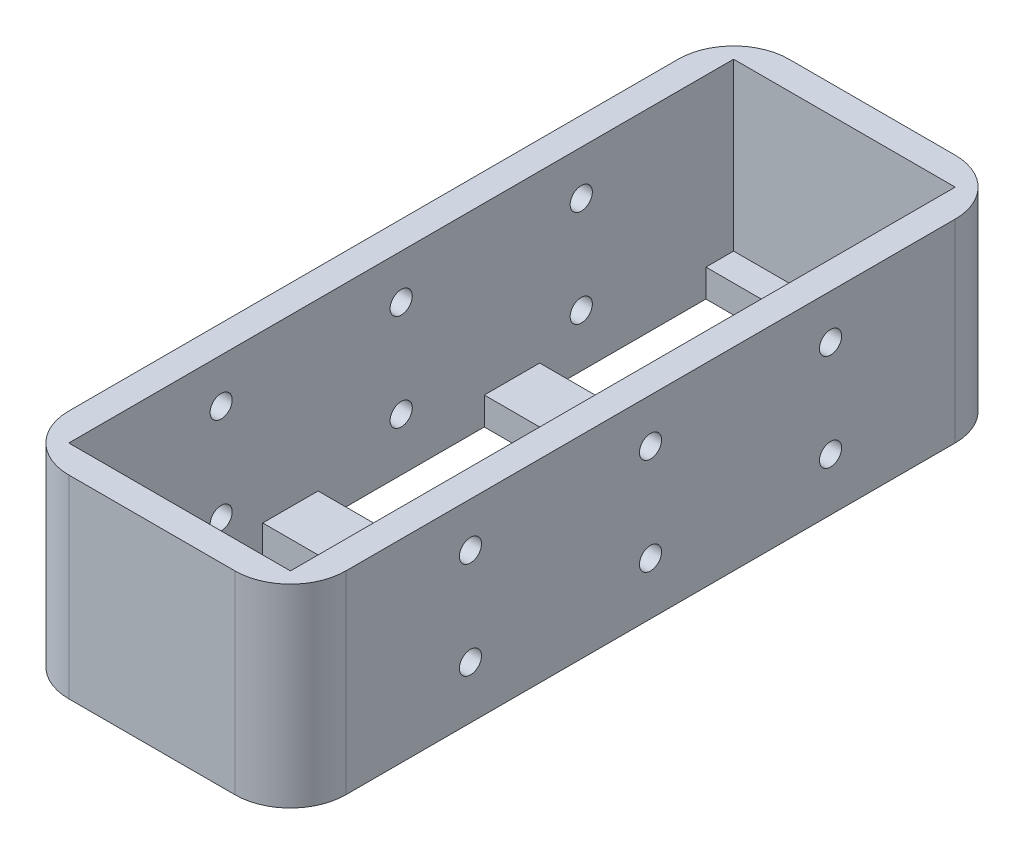
ISO-10303-21;
HEADER;
FILE_DESCRIPTION(('STEP AP214'),'2;1');
FILE_NAME('part.step','',(''),(''),'','','');
FILE_SCHEMA(('AUTOMOTIVE_DESIGN { 1 0 10303 214 1 1 1 1 }'));
ENDSEC;
DATA;
#1=APPLICATION_CONTEXT('core data for automotive mechanical design processes');
#2=APPLICATION_PROTOCOL_DEFINITION('international standard','automotive_design',2000,#1);
#3=PRODUCT_CONTEXT('',#1,'mechanical');
#4=PRODUCT('Part','Part','',(#3));
#5=PRODUCT_RELATED_PRODUCT_CATEGORY('part','',(#4));
#6=PRODUCT_DEFINITION_FORMATION('','',#4);
#7=PRODUCT_DEFINITION_CONTEXT('part definition',#1,'design');
#8=PRODUCT_DEFINITION('design','',#6,#7);
#9=PRODUCT_DEFINITION_SHAPE('','',#8);
#10=(LENGTH_UNIT() NAMED_UNIT(*) SI_UNIT(.MILLI.,.METRE.));
#11=(NAMED_UNIT(*) PLANE_ANGLE_UNIT() SI_UNIT($,.RADIAN.));
#12=(NAMED_UNIT(*) SI_UNIT($,.STERADIAN.) SOLID_ANGLE_UNIT());
#13=UNCERTAINTY_MEASURE_WITH_UNIT(LENGTH_MEASURE(1.E-05),#10,'distance_accuracy_value','');
#14=(GEOMETRIC_REPRESENTATION_CONTEXT(3) GLOBAL_UNCERTAINTY_ASSIGNED_CONTEXT((#13)) GLOBAL_UNIT_ASSIGNED_CONTEXT((#10,
#11,#12)) REPRESENTATION_CONTEXT('',''));
#15=CARTESIAN_POINT('',(0.,0.,0.));
#16=DIRECTION('',(0.,0.,1.));
#17=DIRECTION('',(1.,0.,0.));
#18=AXIS2_PLACEMENT_3D('',#15,#16,#17);
#19=CARTESIAN_POINT('',(-137.729964847329,6.35,0.));
#20=DIRECTION('',(0.,1.,0.));
#21=DIRECTION('',(0.,0.,1.));
#22=AXIS2_PLACEMENT_3D('',#19,#20,#21);
#23=PLANE('',#22);
#24=DIRECTION('',(-1.,0.,0.));
#25=VECTOR('',#24,1.);
#26=CARTESIAN_POINT('',(-137.729964847329,6.35,-31.75));
#27=LINE('',#26,#25);
#28=CARTESIAN_POINT('',(25.4,6.35,-31.75));
#29=VERTEX_POINT('',#28);
#30=CARTESIAN_POINT('',(-25.4,6.35,-31.75));
#31=VERTEX_POINT('',#30);
#32=EDGE_CURVE('E428',#29,#31,#27,.T.);
#33=ORIENTED_EDGE('',*,*,#32,.T.);
#34=DIRECTION('',(0.,0.,1.));
#35=VECTOR('',#34,1.);
#36=CARTESIAN_POINT('',(-25.4,6.35,0.));
#37=LINE('',#36,#35);
#38=CARTESIAN_POINT('',(-25.4,6.35,-19.05));
#39=VERTEX_POINT('',#38);
#40=EDGE_CURVE('E262',#31,#39,#37,.T.);
#41=ORIENTED_EDGE('',*,*,#40,.T.);
#42=DIRECTION('',(1.,0.,0.));
#43=VECTOR('',#42,1.);
#44=CARTESIAN_POINT('',(-137.729964847329,6.35,-19.05));
#45=LINE('',#44,#43);
#46=CARTESIAN_POINT('',(25.4,6.35,-19.05));
#47=VERTEX_POINT('',#46);
#48=EDGE_CURVE('E445',#39,#47,#45,.T.);
#49=ORIENTED_EDGE('',*,*,#48,.T.);
#50=DIRECTION('',(0.,0.,1.));
#51=VECTOR('',#50,1.);
#52=CARTESIAN_POINT('',(25.4,6.35,0.));
#53=LINE('',#52,#51);
#54=EDGE_CURVE('E283',#29,#47,#53,.T.);
#55=ORIENTED_EDGE('',*,*,#54,.F.);
#56=EDGE_LOOP('',(#33,#41,#49,#55));
#57=FACE_BOUND('',#56,.T.);
#58=ADVANCED_FACE('F33',(#57),#23,.T.);
#59=DIRECTION('',(1.,0.,0.));
#60=VECTOR('',#59,1.);
#61=CARTESIAN_POINT('',(-137.729964847329,6.35,19.05));
#62=LINE('',#61,#60);
#63=CARTESIAN_POINT('',(-25.4,6.35,19.05));
#64=VERTEX_POINT('',#63);
#65=CARTESIAN_POINT('',(25.4,6.35,19.05));
#66=VERTEX_POINT('',#65);
#67=EDGE_CURVE('E449',#64,#66,#62,.T.);
#68=ORIENTED_EDGE('',*,*,#67,.F.);
#69=CARTESIAN_POINT('',(-25.4,6.35,31.75));
#70=VERTEX_POINT('',#69);
#71=EDGE_CURVE('E281',#64,#70,#37,.T.);
#72=ORIENTED_EDGE('',*,*,#71,.T.);
#73=DIRECTION('',(1.,0.,0.));
#74=VECTOR('',#73,1.);
#75=CARTESIAN_POINT('',(-137.729964847329,6.35,31.75));
#76=LINE('',#75,#74);
#77=CARTESIAN_POINT('',(25.4,6.35,31.75));
#78=VERTEX_POINT('',#77);
#79=EDGE_CURVE('E460',#70,#78,#76,.T.);
#80=ORIENTED_EDGE('',*,*,#79,.T.);
#81=EDGE_CURVE('E272',#66,#78,#53,.T.);
#82=ORIENTED_EDGE('',*,*,#81,.F.);
#83=EDGE_LOOP('',(#68,#72,#80,#82));
#84=FACE_BOUND('',#83,.T.);
#85=ADVANCED_FACE('F522',(#84),#23,.T.);
#86=DIRECTION('',(1.,0.,0.));
#87=VECTOR('',#86,1.);
#88=CARTESIAN_POINT('',(-137.729964847329,6.35,69.85));
#89=LINE('',#88,#87);
#90=CARTESIAN_POINT('',(-25.4,6.35,69.85));
#91=VERTEX_POINT('',#90);
#92=CARTESIAN_POINT('',(25.4,6.35,69.85));
#93=VERTEX_POINT('',#92);
#94=EDGE_CURVE('E438',#91,#93,#89,.T.);
#95=ORIENTED_EDGE('',*,*,#94,.F.);
#96=CARTESIAN_POINT('',(-25.4,6.35,76.2));
#97=VERTEX_POINT('',#96);
#98=EDGE_CURVE('E268',#91,#97,#37,.T.);
#99=ORIENTED_EDGE('',*,*,#98,.T.);
#100=DIRECTION('',(-1.,0.,0.));
#101=VECTOR('',#100,1.);
#102=CARTESIAN_POINT('',(-137.729964847329,6.35,76.2));
#103=LINE('',#102,#101);
#104=CARTESIAN_POINT('',(25.4,6.35,76.2));
#105=VERTEX_POINT('',#104);
#106=EDGE_CURVE('E217',#105,#97,#103,.T.);
#107=ORIENTED_EDGE('',*,*,#106,.F.);
#108=EDGE_CURVE('E273',#93,#105,#53,.T.);
#109=ORIENTED_EDGE('',*,*,#108,.F.);
#110=EDGE_LOOP('',(#95,#99,#107,#109));
#111=FACE_BOUND('',#110,.T.);
#112=ADVANCED_FACE('F480',(#111),#23,.T.);
#113=DIRECTION('',(-1.,0.,0.));
#114=VECTOR('',#113,1.);
#115=CARTESIAN_POINT('',(-137.729964847329,6.35,-76.2));
#116=LINE('',#115,#114);
#117=CARTESIAN_POINT('',(25.4,6.35,-76.2));
#118=VERTEX_POINT('',#117);
#119=CARTESIAN_POINT('',(-25.4,6.35,-76.2));
#120=VERTEX_POINT('',#119);
#121=EDGE_CURVE('E238',#118,#120,#116,.T.);
#122=ORIENTED_EDGE('',*,*,#121,.T.);
#123=CARTESIAN_POINT('',(-25.4,6.35,-69.85));
#124=VERTEX_POINT('',#123);
#125=EDGE_CURVE('E202',#120,#124,#37,.T.);
#126=ORIENTED_EDGE('',*,*,#125,.T.);
#127=DIRECTION('',(1.,0.,0.));
#128=VECTOR('',#127,1.);
#129=CARTESIAN_POINT('',(-137.729964847329,6.35,-69.85));
#130=LINE('',#129,#128);
#131=CARTESIAN_POINT('',(25.4,6.35,-69.85));
#132=VERTEX_POINT('',#131);
#133=EDGE_CURVE('E432',#124,#132,#130,.T.);
#134=ORIENTED_EDGE('',*,*,#133,.T.);
#135=EDGE_CURVE('E240',#118,#132,#53,.T.);
#136=ORIENTED_EDGE('',*,*,#135,.F.);
#137=EDGE_LOOP('',(#122,#126,#134,#136));
#138=FACE_BOUND('',#137,.T.);
#139=ADVANCED_FACE('F494',(#138),#23,.T.);
#140=CARTESIAN_POINT('',(-137.729964847329,6.35,19.05));
#141=DIRECTION('',(0.,0.,-1.));
#142=DIRECTION('',(-1.,0.,0.));
#143=AXIS2_PLACEMENT_3D('',#140,#141,#142);
#144=PLANE('',#143);
#145=DIRECTION('',(1.,0.,0.));
#146=VECTOR('',#145,1.);
#147=CARTESIAN_POINT('',(-137.729964847329,0.,19.05));
#148=LINE('',#147,#146);
#149=CARTESIAN_POINT('',(-25.4,0.,19.05));
#150=VERTEX_POINT('',#149);
#151=CARTESIAN_POINT('',(25.4,0.,19.05));
#152=VERTEX_POINT('',#151);
#153=EDGE_CURVE('E421',#150,#152,#148,.T.);
#154=ORIENTED_EDGE('',*,*,#153,.F.);
#155=DIRECTION('',(0.,-1.,0.));
#156=VECTOR('',#155,1.);
#157=CARTESIAN_POINT('',(-25.4,6.35,19.05));
#158=LINE('',#157,#156);
#159=EDGE_CURVE('E289',#64,#150,#158,.T.);
#160=ORIENTED_EDGE('',*,*,#159,.F.);
#161=ORIENTED_EDGE('',*,*,#67,.T.);
#162=DIRECTION('',(0.,-1.,0.));
#163=VECTOR('',#162,1.);
#164=CARTESIAN_POINT('',(25.4,6.35,19.05));
#165=LINE('',#164,#163);
#166=EDGE_CURVE('E278',#66,#152,#165,.T.);
#167=ORIENTED_EDGE('',*,*,#166,.T.);
#168=EDGE_LOOP('',(#154,#160,#161,#167));
#169=FACE_BOUND('',#168,.T.);
#170=ADVANCED_FACE('F517',(#169),#144,.T.);
#171=CARTESIAN_POINT('',(-25.4,6.35,0.));
#172=DIRECTION('',(-1.,0.,0.));
#173=DIRECTION('',(0.,0.,1.));
#174=AXIS2_PLACEMENT_3D('',#171,#172,#173);
#175=PLANE('',#174);
#176=CARTESIAN_POINT('',(-25.4,12.065,0.));
#177=DIRECTION('',(-1.,0.,0.));
#178=DIRECTION('',(0.,0.,1.));
#179=AXIS2_PLACEMENT_3D('',#176,#177,#178);
#180=CIRCLE('',#179,2.54);
#181=CARTESIAN_POINT('',(-25.4,12.065,2.54));
#182=VERTEX_POINT('',#181);
#183=EDGE_CURVE('E344',#182,#182,#180,.T.);
#184=ORIENTED_EDGE('',*,*,#183,.T.);
#185=EDGE_LOOP('',(#184));
#186=FACE_BOUND('',#185,.T.);
#187=CARTESIAN_POINT('',(-25.4,12.065,-41.275));
#188=DIRECTION('',(-1.,0.,0.));
#189=DIRECTION('',(0.,0.,1.));
#190=AXIS2_PLACEMENT_3D('',#187,#188,#189);
#191=CIRCLE('',#190,2.54);
#192=CARTESIAN_POINT('',(-25.4,12.065,-38.735));
#193=VERTEX_POINT('',#192);
#194=EDGE_CURVE('E339',#193,#193,#191,.T.);
#195=ORIENTED_EDGE('',*,*,#194,.T.);
#196=EDGE_LOOP('',(#195));
#197=FACE_BOUND('',#196,.T.);
#198=CARTESIAN_POINT('',(-25.4,12.065,41.275));
#199=DIRECTION('',(-1.,0.,0.));
#200=DIRECTION('',(0.,0.,1.));
#201=AXIS2_PLACEMENT_3D('',#198,#199,#200);
#202=CIRCLE('',#201,2.54);
#203=CARTESIAN_POINT('',(-25.4,12.065,43.815));
#204=VERTEX_POINT('',#203);
#205=EDGE_CURVE('E334',#204,#204,#202,.T.);
#206=ORIENTED_EDGE('',*,*,#205,.T.);
#207=EDGE_LOOP('',(#206));
#208=FACE_BOUND('',#207,.T.);
#209=CARTESIAN_POINT('',(-25.4,34.29,41.275));
#210=DIRECTION('',(-1.,0.,0.));
#211=DIRECTION('',(0.,0.,1.));
#212=AXIS2_PLACEMENT_3D('',#209,#210,#211);
#213=CIRCLE('',#212,2.54);
#214=CARTESIAN_POINT('',(-25.4,34.29,43.815));
#215=VERTEX_POINT('',#214);
#216=EDGE_CURVE('E329',#215,#215,#213,.T.);
#217=ORIENTED_EDGE('',*,*,#216,.T.);
#218=EDGE_LOOP('',(#217));
#219=FACE_BOUND('',#218,.T.);
#220=CARTESIAN_POINT('',(-25.4,34.29,-41.275));
#221=DIRECTION('',(-1.,0.,0.));
#222=DIRECTION('',(0.,0.,1.));
#223=AXIS2_PLACEMENT_3D('',#220,#221,#222);
#224=CIRCLE('',#223,2.54);
#225=CARTESIAN_POINT('',(-25.4,34.29,-38.735));
#226=VERTEX_POINT('',#225);
#227=EDGE_CURVE('E324',#226,#226,#224,.T.);
#228=ORIENTED_EDGE('',*,*,#227,.T.);
#229=EDGE_LOOP('',(#228));
#230=FACE_BOUND('',#229,.T.);
#231=CARTESIAN_POINT('',(-25.4,34.29,0.));
#232=DIRECTION('',(-1.,0.,0.));
#233=DIRECTION('',(0.,0.,1.));
#234=AXIS2_PLACEMENT_3D('',#231,#232,#233);
#235=CIRCLE('',#234,2.54);
#236=CARTESIAN_POINT('',(-25.4,34.29,2.54));
#237=VERTEX_POINT('',#236);
#238=EDGE_CURVE('E250',#237,#237,#235,.T.);
#239=ORIENTED_EDGE('',*,*,#238,.T.);
#240=EDGE_LOOP('',(#239));
#241=FACE_BOUND('',#240,.T.);
#242=DIRECTION('',(0.,0.,-1.));
#243=VECTOR('',#242,1.);
#244=CARTESIAN_POINT('',(-25.4,0.,0.));
#245=LINE('',#244,#243);
#246=CARTESIAN_POINT('',(-25.4,0.,-19.05));
#247=VERTEX_POINT('',#246);
#248=EDGE_CURVE('E424',#150,#247,#245,.T.);
#249=ORIENTED_EDGE('',*,*,#248,.T.);
#250=DIRECTION('',(0.,-1.,0.));
#251=VECTOR('',#250,1.);
#252=CARTESIAN_POINT('',(-25.4,6.35,-19.05));
#253=LINE('',#252,#251);
#254=EDGE_CURVE('E290',#39,#247,#253,.T.);
#255=ORIENTED_EDGE('',*,*,#254,.F.);
#256=ORIENTED_EDGE('',*,*,#40,.F.);
#257=DIRECTION('',(0.,-1.,0.));
#258=VECTOR('',#257,1.);
#259=CARTESIAN_POINT('',(-25.4,6.35,-31.75));
#260=LINE('',#259,#258);
#261=CARTESIAN_POINT('',(-25.4,0.,-31.75));
#262=VERTEX_POINT('',#261);
#263=EDGE_CURVE('E305',#31,#262,#260,.T.);
#264=ORIENTED_EDGE('',*,*,#263,.T.);
#265=DIRECTION('',(0.,0.,-1.));
#266=VECTOR('',#265,1.);
#267=CARTESIAN_POINT('',(-25.4,0.,0.));
#268=LINE('',#267,#266);
#269=CARTESIAN_POINT('',(-25.4,0.,-69.85));
#270=VERTEX_POINT('',#269);
#271=EDGE_CURVE('E401',#262,#270,#268,.T.);
#272=ORIENTED_EDGE('',*,*,#271,.T.);
#273=DIRECTION('',(0.,-1.,0.));
#274=VECTOR('',#273,1.);
#275=CARTESIAN_POINT('',(-25.4,6.35,-69.85));
#276=LINE('',#275,#274);
#277=EDGE_CURVE('E309',#124,#270,#276,.T.);
#278=ORIENTED_EDGE('',*,*,#277,.F.);
#279=ORIENTED_EDGE('',*,*,#125,.F.);
#280=DIRECTION('',(0.,-1.,0.));
#281=VECTOR('',#280,1.);
#282=CARTESIAN_POINT('',(-25.4,44.45,-76.2));
#283=LINE('',#282,#281);
#284=CARTESIAN_POINT('',(-25.4,44.45,-76.2));
#285=VERTEX_POINT('',#284);
#286=EDGE_CURVE('E196',#285,#120,#283,.T.);
#287=ORIENTED_EDGE('',*,*,#286,.F.);
#288=DIRECTION('',(0.,0.,1.));
#289=VECTOR('',#288,1.);
#290=CARTESIAN_POINT('',(-25.4,44.45,0.));
#291=LINE('',#290,#289);
#292=CARTESIAN_POINT('',(-25.4,44.45,76.2));
#293=VERTEX_POINT('',#292);
#294=EDGE_CURVE('E200',#285,#293,#291,.T.);
#295=ORIENTED_EDGE('',*,*,#294,.T.);
#296=DIRECTION('',(0.,-1.,0.));
#297=VECTOR('',#296,1.);
#298=CARTESIAN_POINT('',(-25.4,44.45,76.2));
#299=LINE('',#298,#297);
#300=EDGE_CURVE('E237',#293,#97,#299,.T.);
#301=ORIENTED_EDGE('',*,*,#300,.T.);
#302=ORIENTED_EDGE('',*,*,#98,.F.);
#303=DIRECTION('',(0.,-1.,0.));
#304=VECTOR('',#303,1.);
#305=CARTESIAN_POINT('',(-25.4,6.35,69.85));
#306=LINE('',#305,#304);
#307=CARTESIAN_POINT('',(-25.4,0.,69.85));
#308=VERTEX_POINT('',#307);
#309=EDGE_CURVE('E276',#91,#308,#306,.T.);
#310=ORIENTED_EDGE('',*,*,#309,.T.);
#311=DIRECTION('',(0.,0.,-1.));
#312=VECTOR('',#311,1.);
#313=CARTESIAN_POINT('',(-25.4,0.,0.));
#314=LINE('',#313,#312);
#315=CARTESIAN_POINT('',(-25.4,0.,31.75));
#316=VERTEX_POINT('',#315);
#317=EDGE_CURVE('E412',#308,#316,#314,.T.);
#318=ORIENTED_EDGE('',*,*,#317,.T.);
#319=DIRECTION('',(0.,-1.,0.));
#320=VECTOR('',#319,1.);
#321=CARTESIAN_POINT('',(-25.4,6.35,31.75));
#322=LINE('',#321,#320);
#323=EDGE_CURVE('E279',#70,#316,#322,.T.);
#324=ORIENTED_EDGE('',*,*,#323,.F.);
#325=ORIENTED_EDGE('',*,*,#71,.F.);
#326=ORIENTED_EDGE('',*,*,#159,.T.);
#327=EDGE_LOOP('',(#249,#255,#256,#264,#272,#278,#279,#287,#295,#301,#302,#310,#318,#324,#325,#326));
#328=FACE_BOUND('',#327,.T.);
#329=ADVANCED_FACE('F199',(#186,#197,#208,#219,#230,#241,#328),#175,.F.);
#330=CARTESIAN_POINT('',(-137.729964847329,6.35,-19.05));
#331=DIRECTION('',(0.,0.,-1.));
#332=DIRECTION('',(-1.,0.,0.));
#333=AXIS2_PLACEMENT_3D('',#330,#331,#332);
#334=PLANE('',#333);
#335=DIRECTION('',(1.,0.,0.));
#336=VECTOR('',#335,1.);
#337=CARTESIAN_POINT('',(-137.729964847329,0.,-19.05));
#338=LINE('',#337,#336);
#339=CARTESIAN_POINT('',(25.4,0.,-19.05));
#340=VERTEX_POINT('',#339);
#341=EDGE_CURVE('E425',#247,#340,#338,.T.);
#342=ORIENTED_EDGE('',*,*,#341,.T.);
#343=DIRECTION('',(0.,-1.,0.));
#344=VECTOR('',#343,1.);
#345=CARTESIAN_POINT('',(25.4,6.35,-19.05));
#346=LINE('',#345,#344);
#347=EDGE_CURVE('E296',#47,#340,#346,.T.);
#348=ORIENTED_EDGE('',*,*,#347,.F.);
#349=ORIENTED_EDGE('',*,*,#48,.F.);
#350=ORIENTED_EDGE('',*,*,#254,.T.);
#351=EDGE_LOOP('',(#342,#348,#349,#350));
#352=FACE_BOUND('',#351,.T.);
#353=ADVANCED_FACE('F508',(#352),#334,.F.);
#354=CARTESIAN_POINT('',(-137.729964847329,6.35,69.85));
#355=DIRECTION('',(0.,0.,-1.));
#356=DIRECTION('',(-1.,0.,0.));
#357=AXIS2_PLACEMENT_3D('',#354,#355,#356);
#358=PLANE('',#357);
#359=DIRECTION('',(1.,0.,0.));
#360=VECTOR('',#359,1.);
#361=CARTESIAN_POINT('',(-137.729964847329,0.,69.85));
#362=LINE('',#361,#360);
#363=CARTESIAN_POINT('',(25.4,0.,69.85));
#364=VERTEX_POINT('',#363);
#365=EDGE_CURVE('E409',#308,#364,#362,.T.);
#366=ORIENTED_EDGE('',*,*,#365,.F.);
#367=ORIENTED_EDGE('',*,*,#309,.F.);
#368=ORIENTED_EDGE('',*,*,#94,.T.);
#369=DIRECTION('',(0.,-1.,0.));
#370=VECTOR('',#369,1.);
#371=CARTESIAN_POINT('',(25.4,6.35,69.85));
#372=LINE('',#371,#370);
#373=EDGE_CURVE('E308',#93,#364,#372,.T.);
#374=ORIENTED_EDGE('',*,*,#373,.T.);
#375=EDGE_LOOP('',(#366,#367,#368,#374));
#376=FACE_BOUND('',#375,.T.);
#377=ADVANCED_FACE('F477',(#376),#358,.T.);
#378=CARTESIAN_POINT('',(-137.729964847329,6.35,31.75));
#379=DIRECTION('',(0.,0.,-1.));
#380=DIRECTION('',(-1.,0.,0.));
#381=AXIS2_PLACEMENT_3D('',#378,#379,#380);
#382=PLANE('',#381);
#383=DIRECTION('',(1.,0.,0.));
#384=VECTOR('',#383,1.);
#385=CARTESIAN_POINT('',(-137.729964847329,0.,31.75));
#386=LINE('',#385,#384);
#387=CARTESIAN_POINT('',(25.4,0.,31.75));
#388=VERTEX_POINT('',#387);
#389=EDGE_CURVE('E415',#316,#388,#386,.T.);
#390=ORIENTED_EDGE('',*,*,#389,.T.);
#391=DIRECTION('',(0.,-1.,0.));
#392=VECTOR('',#391,1.);
#393=CARTESIAN_POINT('',(25.4,6.35,31.75));
#394=LINE('',#393,#392);
#395=EDGE_CURVE('E286',#78,#388,#394,.T.);
#396=ORIENTED_EDGE('',*,*,#395,.F.);
#397=ORIENTED_EDGE('',*,*,#79,.F.);
#398=ORIENTED_EDGE('',*,*,#323,.T.);
#399=EDGE_LOOP('',(#390,#396,#397,#398));
#400=FACE_BOUND('',#399,.T.);
#401=ADVANCED_FACE('F515',(#400),#382,.F.);
#402=CARTESIAN_POINT('',(-137.729964847329,6.35,-31.75));
#403=DIRECTION('',(0.,0.,1.));
#404=DIRECTION('',(1.,0.,0.));
#405=AXIS2_PLACEMENT_3D('',#402,#403,#404);
#406=PLANE('',#405);
#407=DIRECTION('',(-1.,0.,0.));
#408=VECTOR('',#407,1.);
#409=CARTESIAN_POINT('',(-137.729964847329,0.,-31.75));
#410=LINE('',#409,#408);
#411=CARTESIAN_POINT('',(25.4,0.,-31.75));
#412=VERTEX_POINT('',#411);
#413=EDGE_CURVE('E398',#412,#262,#410,.T.);
#414=ORIENTED_EDGE('',*,*,#413,.T.);
#415=ORIENTED_EDGE('',*,*,#263,.F.);
#416=ORIENTED_EDGE('',*,*,#32,.F.);
#417=DIRECTION('',(0.,-1.,0.));
#418=VECTOR('',#417,1.);
#419=CARTESIAN_POINT('',(25.4,6.35,-31.75));
#420=LINE('',#419,#418);
#421=EDGE_CURVE('E448',#29,#412,#420,.T.);
#422=ORIENTED_EDGE('',*,*,#421,.T.);
#423=EDGE_LOOP('',(#414,#415,#416,#422));
#424=FACE_BOUND('',#423,.T.);
#425=ADVANCED_FACE('F712',(#424),#406,.F.);
#426=CARTESIAN_POINT('',(-137.729964847329,6.35,-69.85));
#427=DIRECTION('',(0.,0.,-1.));
#428=DIRECTION('',(-1.,0.,0.));
#429=AXIS2_PLACEMENT_3D('',#426,#427,#428);
#430=PLANE('',#429);
#431=DIRECTION('',(1.,0.,0.));
#432=VECTOR('',#431,1.);
#433=CARTESIAN_POINT('',(-137.729964847329,0.,-69.85));
#434=LINE('',#433,#432);
#435=CARTESIAN_POINT('',(25.4,0.,-69.85));
#436=VERTEX_POINT('',#435);
#437=EDGE_CURVE('E403',#270,#436,#434,.T.);
#438=ORIENTED_EDGE('',*,*,#437,.T.);
#439=DIRECTION('',(0.,-1.,0.));
#440=VECTOR('',#439,1.);
#441=CARTESIAN_POINT('',(25.4,6.35,-69.85));
#442=LINE('',#441,#440);
#443=EDGE_CURVE('E314',#132,#436,#442,.T.);
#444=ORIENTED_EDGE('',*,*,#443,.F.);
#445=ORIENTED_EDGE('',*,*,#133,.F.);
#446=ORIENTED_EDGE('',*,*,#277,.T.);
#447=EDGE_LOOP('',(#438,#444,#445,#446));
#448=FACE_BOUND('',#447,.T.);
#449=ADVANCED_FACE('F498',(#448),#430,.F.);
#450=CARTESIAN_POINT('',(31.75,6.35,0.));
#451=DIRECTION('',(-1.,0.,0.));
#452=DIRECTION('',(0.,0.,1.));
#453=AXIS2_PLACEMENT_3D('',#450,#451,#452);
#454=PLANE('',#453);
#455=CARTESIAN_POINT('',(31.75,12.065,0.));
#456=DIRECTION('',(1.,0.,0.));
#457=DIRECTION('',(0.,0.,-1.));
#458=AXIS2_PLACEMENT_3D('',#455,#456,#457);
#459=CIRCLE('',#458,2.54);
#460=CARTESIAN_POINT('',(31.75,12.065,-2.54));
#461=VERTEX_POINT('',#460);
#462=EDGE_CURVE('E791',#461,#461,#459,.T.);
#463=ORIENTED_EDGE('',*,*,#462,.F.);
#464=EDGE_LOOP('',(#463));
#465=FACE_BOUND('',#464,.T.);
#466=CARTESIAN_POINT('',(31.75,12.065,-41.275));
#467=DIRECTION('',(1.,0.,0.));
#468=DIRECTION('',(0.,0.,-1.));
#469=AXIS2_PLACEMENT_3D('',#466,#467,#468);
#470=CIRCLE('',#469,2.54);
#471=CARTESIAN_POINT('',(31.75,12.065,-43.815));
#472=VERTEX_POINT('',#471);
#473=EDGE_CURVE('E798',#472,#472,#470,.T.);
#474=ORIENTED_EDGE('',*,*,#473,.F.);
#475=EDGE_LOOP('',(#474));
#476=FACE_BOUND('',#475,.T.);
#477=CARTESIAN_POINT('',(31.75,12.065,41.275));
#478=DIRECTION('',(1.,0.,0.));
#479=DIRECTION('',(0.,0.,-1.));
#480=AXIS2_PLACEMENT_3D('',#477,#478,#479);
#481=CIRCLE('',#480,2.54);
#482=CARTESIAN_POINT('',(31.75,12.065,38.735));
#483=VERTEX_POINT('',#482);
#484=EDGE_CURVE('E805',#483,#483,#481,.T.);
#485=ORIENTED_EDGE('',*,*,#484,.F.);
#486=EDGE_LOOP('',(#485));
#487=FACE_BOUND('',#486,.T.);
#488=CARTESIAN_POINT('',(31.75,34.29,41.275));
#489=DIRECTION('',(1.,0.,0.));
#490=DIRECTION('',(0.,0.,-1.));
#491=AXIS2_PLACEMENT_3D('',#488,#489,#490);
#492=CIRCLE('',#491,2.54);
#493=CARTESIAN_POINT('',(31.75,34.29,38.735));
#494=VERTEX_POINT('',#493);
#495=EDGE_CURVE('E812',#494,#494,#492,.T.);
#496=ORIENTED_EDGE('',*,*,#495,.F.);
#497=EDGE_LOOP('',(#496));
#498=FACE_BOUND('',#497,.T.);
#499=CARTESIAN_POINT('',(31.75,34.29,-41.275));
#500=DIRECTION('',(1.,0.,0.));
#501=DIRECTION('',(0.,0.,-1.));
#502=AXIS2_PLACEMENT_3D('',#499,#500,#501);
#503=CIRCLE('',#502,2.54);
#504=CARTESIAN_POINT('',(31.75,34.29,-43.815));
#505=VERTEX_POINT('',#504);
#506=EDGE_CURVE('E819',#505,#505,#503,.T.);
#507=ORIENTED_EDGE('',*,*,#506,.F.);
#508=EDGE_LOOP('',(#507));
#509=FACE_BOUND('',#508,.T.);
#510=CARTESIAN_POINT('',(31.75,34.29,0.));
#511=DIRECTION('',(1.,0.,0.));
#512=DIRECTION('',(0.,0.,-1.));
#513=AXIS2_PLACEMENT_3D('',#510,#511,#512);
#514=CIRCLE('',#513,2.54);
#515=CARTESIAN_POINT('',(31.75,34.29,-2.54));
#516=VERTEX_POINT('',#515);
#517=EDGE_CURVE('E826',#516,#516,#514,.T.);
#518=ORIENTED_EDGE('',*,*,#517,.F.);
#519=EDGE_LOOP('',(#518));
#520=FACE_BOUND('',#519,.T.);
#521=DIRECTION('',(0.,0.,-1.));
#522=VECTOR('',#521,1.);
#523=CARTESIAN_POINT('',(31.75,0.,0.));
#524=LINE('',#523,#522);
#525=CARTESIAN_POINT('',(31.75,0.,69.85));
#526=VERTEX_POINT('',#525);
#527=CARTESIAN_POINT('',(31.75,0.,-69.85));
#528=VERTEX_POINT('',#527);
#529=EDGE_CURVE('E207',#526,#528,#524,.T.);
#530=ORIENTED_EDGE('',*,*,#529,.T.);
#531=DIRECTION('',(0.,-1.,0.));
#532=VECTOR('',#531,1.);
#533=CARTESIAN_POINT('',(31.75,44.45,-69.85));
#534=LINE('',#533,#532);
#535=CARTESIAN_POINT('',(31.75,44.45,-69.85));
#536=VERTEX_POINT('',#535);
#537=EDGE_CURVE('E48',#528,#536,#534,.F.);
#538=ORIENTED_EDGE('',*,*,#537,.T.);
#539=DIRECTION('',(0.,0.,-1.));
#540=VECTOR('',#539,1.);
#541=CARTESIAN_POINT('',(31.75,44.45,0.));
#542=LINE('',#541,#540);
#543=CARTESIAN_POINT('',(31.75,44.45,69.85));
#544=VERTEX_POINT('',#543);
#545=EDGE_CURVE('E229',#544,#536,#542,.T.);
#546=ORIENTED_EDGE('',*,*,#545,.F.);
#547=DIRECTION('',(0.,-1.,0.));
#548=VECTOR('',#547,1.);
#549=CARTESIAN_POINT('',(31.75,6.35,69.85));
#550=LINE('',#549,#548);
#551=EDGE_CURVE('E371',#544,#526,#550,.T.);
#552=ORIENTED_EDGE('',*,*,#551,.T.);
#553=EDGE_LOOP('',(#530,#538,#546,#552));
#554=FACE_BOUND('',#553,.T.);
#555=ADVANCED_FACE('F386',(#465,#476,#487,#498,#509,#520,#554),#454,.F.);
#556=CARTESIAN_POINT('',(-137.729964847329,6.35,-82.55));
#557=DIRECTION('',(0.,0.,-1.));
#558=DIRECTION('',(-1.,0.,0.));
#559=AXIS2_PLACEMENT_3D('',#556,#557,#558);
#560=PLANE('',#559);
#561=DIRECTION('',(1.,0.,0.));
#562=VECTOR('',#561,1.);
#563=CARTESIAN_POINT('',(-137.729964847329,0.,-82.55));
#564=LINE('',#563,#562);
#565=CARTESIAN_POINT('',(-19.05,0.,-82.55));
#566=VERTEX_POINT('',#565);
#567=CARTESIAN_POINT('',(19.05,0.,-82.55));
#568=VERTEX_POINT('',#567);
#569=EDGE_CURVE('E392',#566,#568,#564,.T.);
#570=ORIENTED_EDGE('',*,*,#569,.F.);
#571=DIRECTION('',(0.,-1.,0.));
#572=VECTOR('',#571,1.);
#573=CARTESIAN_POINT('',(-19.05,6.35,-82.55));
#574=LINE('',#573,#572);
#575=CARTESIAN_POINT('',(-19.05,44.45,-82.55));
#576=VERTEX_POINT('',#575);
#577=EDGE_CURVE('E362',#566,#576,#574,.F.);
#578=ORIENTED_EDGE('',*,*,#577,.T.);
#579=DIRECTION('',(-1.,0.,0.));
#580=VECTOR('',#579,1.);
#581=CARTESIAN_POINT('',(-137.729964847329,44.45,-82.55));
#582=LINE('',#581,#580);
#583=CARTESIAN_POINT('',(19.05,44.45,-82.55));
#584=VERTEX_POINT('',#583);
#585=EDGE_CURVE('E231',#584,#576,#582,.T.);
#586=ORIENTED_EDGE('',*,*,#585,.F.);
#587=DIRECTION('',(0.,-1.,0.));
#588=VECTOR('',#587,1.);
#589=CARTESIAN_POINT('',(19.05,0.,-82.55));
#590=LINE('',#589,#588);
#591=EDGE_CURVE('E359',#584,#568,#590,.T.);
#592=ORIENTED_EDGE('',*,*,#591,.T.);
#593=EDGE_LOOP('',(#570,#578,#586,#592));
#594=FACE_BOUND('',#593,.T.);
#595=ADVANCED_FACE('F603',(#594),#560,.T.);
#596=CARTESIAN_POINT('',(-31.75,6.35,0.));
#597=DIRECTION('',(-1.,0.,0.));
#598=DIRECTION('',(0.,0.,1.));
#599=AXIS2_PLACEMENT_3D('',#596,#597,#598);
#600=PLANE('',#599);
#601=CARTESIAN_POINT('',(-31.75,12.065,0.));
#602=DIRECTION('',(1.,0.,0.));
#603=DIRECTION('',(0.,0.,-1.));
#604=AXIS2_PLACEMENT_3D('',#601,#602,#603);
#605=CIRCLE('',#604,2.54);
#606=CARTESIAN_POINT('',(-31.75,12.065,-2.54));
#607=VERTEX_POINT('',#606);
#608=EDGE_CURVE('E345',#607,#607,#605,.T.);
#609=ORIENTED_EDGE('',*,*,#608,.T.);
#610=EDGE_LOOP('',(#609));
#611=FACE_BOUND('',#610,.T.);
#612=CARTESIAN_POINT('',(-31.75,12.065,-41.275));
#613=DIRECTION('',(1.,0.,0.));
#614=DIRECTION('',(0.,0.,-1.));
#615=AXIS2_PLACEMENT_3D('',#612,#613,#614);
#616=CIRCLE('',#615,2.54);
#617=CARTESIAN_POINT('',(-31.75,12.065,-43.815));
#618=VERTEX_POINT('',#617);
#619=EDGE_CURVE('E340',#618,#618,#616,.T.);
#620=ORIENTED_EDGE('',*,*,#619,.T.);
#621=EDGE_LOOP('',(#620));
#622=FACE_BOUND('',#621,.T.);
#623=CARTESIAN_POINT('',(-31.75,12.065,41.275));
#624=DIRECTION('',(1.,0.,0.));
#625=DIRECTION('',(0.,0.,-1.));
#626=AXIS2_PLACEMENT_3D('',#623,#624,#625);
#627=CIRCLE('',#626,2.54);
#628=CARTESIAN_POINT('',(-31.75,12.065,38.735));
#629=VERTEX_POINT('',#628);
#630=EDGE_CURVE('E335',#629,#629,#627,.T.);
#631=ORIENTED_EDGE('',*,*,#630,.T.);
#632=EDGE_LOOP('',(#631));
#633=FACE_BOUND('',#632,.T.);
#634=CARTESIAN_POINT('',(-31.75,34.29,41.275));
#635=DIRECTION('',(1.,0.,0.));
#636=DIRECTION('',(0.,0.,-1.));
#637=AXIS2_PLACEMENT_3D('',#634,#635,#636);
#638=CIRCLE('',#637,2.54);
#639=CARTESIAN_POINT('',(-31.75,34.29,38.735));
#640=VERTEX_POINT('',#639);
#641=EDGE_CURVE('E330',#640,#640,#638,.T.);
#642=ORIENTED_EDGE('',*,*,#641,.T.);
#643=EDGE_LOOP('',(#642));
#644=FACE_BOUND('',#643,.T.);
#645=CARTESIAN_POINT('',(-31.75,34.29,-41.275));
#646=DIRECTION('',(1.,0.,0.));
#647=DIRECTION('',(0.,0.,-1.));
#648=AXIS2_PLACEMENT_3D('',#645,#646,#647);
#649=CIRCLE('',#648,2.54);
#650=CARTESIAN_POINT('',(-31.75,34.29,-43.815));
#651=VERTEX_POINT('',#650);
#652=EDGE_CURVE('E325',#651,#651,#649,.T.);
#653=ORIENTED_EDGE('',*,*,#652,.T.);
#654=EDGE_LOOP('',(#653));
#655=FACE_BOUND('',#654,.T.);
#656=CARTESIAN_POINT('',(-31.75,34.29,0.));
#657=DIRECTION('',(1.,0.,0.));
#658=DIRECTION('',(0.,0.,-1.));
#659=AXIS2_PLACEMENT_3D('',#656,#657,#658);
#660=CIRCLE('',#659,2.54);
#661=CARTESIAN_POINT('',(-31.75,34.29,-2.54));
#662=VERTEX_POINT('',#661);
#663=EDGE_CURVE('E320',#662,#662,#660,.T.);
#664=ORIENTED_EDGE('',*,*,#663,.T.);
#665=EDGE_LOOP('',(#664));
#666=FACE_BOUND('',#665,.T.);
#667=DIRECTION('',(0.,0.,1.));
#668=VECTOR('',#667,1.);
#669=CARTESIAN_POINT('',(-31.75,44.45,0.));
#670=LINE('',#669,#668);
#671=CARTESIAN_POINT('',(-31.75,44.45,-69.85));
#672=VERTEX_POINT('',#671);
#673=CARTESIAN_POINT('',(-31.75,44.45,69.85));
#674=VERTEX_POINT('',#673);
#675=EDGE_CURVE('E234',#672,#674,#670,.T.);
#676=ORIENTED_EDGE('',*,*,#675,.F.);
#677=DIRECTION('',(0.,-1.,0.));
#678=VECTOR('',#677,1.);
#679=CARTESIAN_POINT('',(-31.75,6.35,-69.85));
#680=LINE('',#679,#678);
#681=CARTESIAN_POINT('',(-31.75,0.,-69.85));
#682=VERTEX_POINT('',#681);
#683=EDGE_CURVE('E348',#672,#682,#680,.T.);
#684=ORIENTED_EDGE('',*,*,#683,.T.);
#685=DIRECTION('',(0.,0.,-1.));
#686=VECTOR('',#685,1.);
#687=CARTESIAN_POINT('',(-31.75,0.,0.));
#688=LINE('',#687,#686);
#689=CARTESIAN_POINT('',(-31.75,0.,69.85));
#690=VERTEX_POINT('',#689);
#691=EDGE_CURVE('E393',#690,#682,#688,.T.);
#692=ORIENTED_EDGE('',*,*,#691,.F.);
#693=DIRECTION('',(0.,-1.,0.));
#694=VECTOR('',#693,1.);
#695=CARTESIAN_POINT('',(-31.75,44.45,69.85));
#696=LINE('',#695,#694);
#697=EDGE_CURVE('E346',#690,#674,#696,.F.);
#698=ORIENTED_EDGE('',*,*,#697,.T.);
#699=EDGE_LOOP('',(#676,#684,#692,#698));
#700=FACE_BOUND('',#699,.T.);
#701=ADVANCED_FACE('F617',(#611,#622,#633,#644,#655,#666,#700),#600,.T.);
#702=CARTESIAN_POINT('',(-137.729964847329,6.35,82.55));
#703=DIRECTION('',(0.,0.,-1.));
#704=DIRECTION('',(-1.,0.,0.));
#705=AXIS2_PLACEMENT_3D('',#702,#703,#704);
#706=PLANE('',#705);
#707=DIRECTION('',(1.,0.,0.));
#708=VECTOR('',#707,1.);
#709=CARTESIAN_POINT('',(-137.729964847329,44.45,82.55));
#710=LINE('',#709,#708);
#711=CARTESIAN_POINT('',(-19.05,44.45,82.55));
#712=VERTEX_POINT('',#711);
#713=CARTESIAN_POINT('',(19.05,44.45,82.55));
#714=VERTEX_POINT('',#713);
#715=EDGE_CURVE('E227',#712,#714,#710,.T.);
#716=ORIENTED_EDGE('',*,*,#715,.F.);
#717=DIRECTION('',(0.,-1.,0.));
#718=VECTOR('',#717,1.);
#719=CARTESIAN_POINT('',(-19.05,0.,82.55));
#720=LINE('',#719,#718);
#721=CARTESIAN_POINT('',(-19.05,0.,82.55));
#722=VERTEX_POINT('',#721);
#723=EDGE_CURVE('E11',#712,#722,#720,.T.);
#724=ORIENTED_EDGE('',*,*,#723,.T.);
#725=DIRECTION('',(1.,0.,0.));
#726=VECTOR('',#725,1.);
#727=CARTESIAN_POINT('',(-137.729964847329,0.,82.55));
#728=LINE('',#727,#726);
#729=CARTESIAN_POINT('',(19.05,0.,82.55));
#730=VERTEX_POINT('',#729);
#731=EDGE_CURVE('E381',#722,#730,#728,.T.);
#732=ORIENTED_EDGE('',*,*,#731,.T.);
#733=DIRECTION('',(0.,-1.,0.));
#734=VECTOR('',#733,1.);
#735=CARTESIAN_POINT('',(19.05,6.35,82.55));
#736=LINE('',#735,#734);
#737=EDGE_CURVE('E41',#730,#714,#736,.F.);
#738=ORIENTED_EDGE('',*,*,#737,.T.);
#739=EDGE_LOOP('',(#716,#724,#732,#738));
#740=FACE_BOUND('',#739,.T.);
#741=ADVANCED_FACE('F378',(#740),#706,.F.);
#742=CARTESIAN_POINT('',(25.4,6.35,0.));
#743=DIRECTION('',(-1.,0.,0.));
#744=DIRECTION('',(0.,0.,1.));
#745=AXIS2_PLACEMENT_3D('',#742,#743,#744);
#746=PLANE('',#745);
#747=CARTESIAN_POINT('',(25.4,12.065,0.));
#748=DIRECTION('',(-1.,0.,0.));
#749=DIRECTION('',(0.,0.,1.));
#750=AXIS2_PLACEMENT_3D('',#747,#748,#749);
#751=CIRCLE('',#750,2.54);
#752=CARTESIAN_POINT('',(25.4,12.065,2.54));
#753=VERTEX_POINT('',#752);
#754=EDGE_CURVE('E341',#753,#753,#751,.T.);
#755=ORIENTED_EDGE('',*,*,#754,.F.);
#756=EDGE_LOOP('',(#755));
#757=FACE_BOUND('',#756,.T.);
#758=CARTESIAN_POINT('',(25.4,12.065,-41.275));
#759=DIRECTION('',(-1.,0.,0.));
#760=DIRECTION('',(0.,0.,1.));
#761=AXIS2_PLACEMENT_3D('',#758,#759,#760);
#762=CIRCLE('',#761,2.54);
#763=CARTESIAN_POINT('',(25.4,12.065,-38.735));
#764=VERTEX_POINT('',#763);
#765=EDGE_CURVE('E336',#764,#764,#762,.T.);
#766=ORIENTED_EDGE('',*,*,#765,.F.);
#767=EDGE_LOOP('',(#766));
#768=FACE_BOUND('',#767,.T.);
#769=CARTESIAN_POINT('',(25.4,12.065,41.275));
#770=DIRECTION('',(-1.,0.,0.));
#771=DIRECTION('',(0.,0.,1.));
#772=AXIS2_PLACEMENT_3D('',#769,#770,#771);
#773=CIRCLE('',#772,2.54);
#774=CARTESIAN_POINT('',(25.4,12.065,43.815));
#775=VERTEX_POINT('',#774);
#776=EDGE_CURVE('E331',#775,#775,#773,.T.);
#777=ORIENTED_EDGE('',*,*,#776,.F.);
#778=EDGE_LOOP('',(#777));
#779=FACE_BOUND('',#778,.T.);
#780=CARTESIAN_POINT('',(25.4,34.29,41.275));
#781=DIRECTION('',(-1.,0.,0.));
#782=DIRECTION('',(0.,0.,1.));
#783=AXIS2_PLACEMENT_3D('',#780,#781,#782);
#784=CIRCLE('',#783,2.54);
#785=CARTESIAN_POINT('',(25.4,34.29,43.815));
#786=VERTEX_POINT('',#785);
#787=EDGE_CURVE('E326',#786,#786,#784,.T.);
#788=ORIENTED_EDGE('',*,*,#787,.F.);
#789=EDGE_LOOP('',(#788));
#790=FACE_BOUND('',#789,.T.);
#791=CARTESIAN_POINT('',(25.4,34.29,-41.275));
#792=DIRECTION('',(-1.,0.,0.));
#793=DIRECTION('',(0.,0.,1.));
#794=AXIS2_PLACEMENT_3D('',#791,#792,#793);
#795=CIRCLE('',#794,2.54);
#796=CARTESIAN_POINT('',(25.4,34.29,-38.735));
#797=VERTEX_POINT('',#796);
#798=EDGE_CURVE('E321',#797,#797,#795,.T.);
#799=ORIENTED_EDGE('',*,*,#798,.F.);
#800=EDGE_LOOP('',(#799));
#801=FACE_BOUND('',#800,.T.);
#802=CARTESIAN_POINT('',(25.4,34.29,0.));
#803=DIRECTION('',(-1.,0.,0.));
#804=DIRECTION('',(0.,0.,1.));
#805=AXIS2_PLACEMENT_3D('',#802,#803,#804);
#806=CIRCLE('',#805,2.54);
#807=CARTESIAN_POINT('',(25.4,34.29,2.54));
#808=VERTEX_POINT('',#807);
#809=EDGE_CURVE('E317',#808,#808,#806,.T.);
#810=ORIENTED_EDGE('',*,*,#809,.F.);
#811=EDGE_LOOP('',(#810));
#812=FACE_BOUND('',#811,.T.);
#813=DIRECTION('',(0.,0.,-1.));
#814=VECTOR('',#813,1.);
#815=CARTESIAN_POINT('',(25.4,0.,0.));
#816=LINE('',#815,#814);
#817=EDGE_CURVE('E255',#152,#340,#816,.T.);
#818=ORIENTED_EDGE('',*,*,#817,.F.);
#819=ORIENTED_EDGE('',*,*,#166,.F.);
#820=ORIENTED_EDGE('',*,*,#81,.T.);
#821=ORIENTED_EDGE('',*,*,#395,.T.);
#822=DIRECTION('',(0.,0.,-1.));
#823=VECTOR('',#822,1.);
#824=CARTESIAN_POINT('',(25.4,0.,0.));
#825=LINE('',#824,#823);
#826=EDGE_CURVE('E418',#364,#388,#825,.T.);
#827=ORIENTED_EDGE('',*,*,#826,.F.);
#828=ORIENTED_EDGE('',*,*,#373,.F.);
#829=ORIENTED_EDGE('',*,*,#108,.T.);
#830=DIRECTION('',(0.,-1.,0.));
#831=VECTOR('',#830,1.);
#832=CARTESIAN_POINT('',(25.4,44.45,76.2));
#833=LINE('',#832,#831);
#834=CARTESIAN_POINT('',(25.4,44.45,76.2));
#835=VERTEX_POINT('',#834);
#836=EDGE_CURVE('E244',#835,#105,#833,.T.);
#837=ORIENTED_EDGE('',*,*,#836,.F.);
#838=DIRECTION('',(0.,0.,1.));
#839=VECTOR('',#838,1.);
#840=CARTESIAN_POINT('',(25.4,44.45,0.));
#841=LINE('',#840,#839);
#842=CARTESIAN_POINT('',(25.4,44.45,-76.2));
#843=VERTEX_POINT('',#842);
#844=EDGE_CURVE('E221',#843,#835,#841,.T.);
#845=ORIENTED_EDGE('',*,*,#844,.F.);
#846=DIRECTION('',(0.,-1.,0.));
#847=VECTOR('',#846,1.);
#848=CARTESIAN_POINT('',(25.4,44.45,-76.2));
#849=LINE('',#848,#847);
#850=EDGE_CURVE('E208',#843,#118,#849,.T.);
#851=ORIENTED_EDGE('',*,*,#850,.T.);
#852=ORIENTED_EDGE('',*,*,#135,.T.);
#853=ORIENTED_EDGE('',*,*,#443,.T.);
#854=DIRECTION('',(0.,0.,-1.));
#855=VECTOR('',#854,1.);
#856=CARTESIAN_POINT('',(25.4,0.,0.));
#857=LINE('',#856,#855);
#858=EDGE_CURVE('E406',#412,#436,#857,.T.);
#859=ORIENTED_EDGE('',*,*,#858,.F.);
#860=ORIENTED_EDGE('',*,*,#421,.F.);
#861=ORIENTED_EDGE('',*,*,#54,.T.);
#862=ORIENTED_EDGE('',*,*,#347,.T.);
#863=EDGE_LOOP('',(#818,#819,#820,#821,#827,#828,#829,#837,#845,#851,#852,#853,#859,#860,#861,#862));
#864=FACE_BOUND('',#863,.T.);
#865=ADVANCED_FACE('F485',(#757,#768,#779,#790,#801,#812,#864),#746,.T.);
#866=CARTESIAN_POINT('',(-137.729964847329,0.,0.));
#867=DIRECTION('',(0.,1.,0.));
#868=DIRECTION('',(0.,0.,1.));
#869=AXIS2_PLACEMENT_3D('',#866,#867,#868);
#870=PLANE('',#869);
#871=ORIENTED_EDGE('',*,*,#691,.T.);
#872=CARTESIAN_POINT('',(-19.05,0.,-69.85));
#873=DIRECTION('',(0.,1.,0.));
#874=DIRECTION('',(0.,0.,1.));
#875=AXIS2_PLACEMENT_3D('',#872,#873,#874);
#876=CIRCLE('',#875,12.7);
#877=EDGE_CURVE('E357',#682,#566,#876,.F.);
#878=ORIENTED_EDGE('',*,*,#877,.T.);
#879=ORIENTED_EDGE('',*,*,#569,.T.);
#880=CARTESIAN_POINT('',(19.05,0.,-69.85));
#881=DIRECTION('',(0.,1.,0.));
#882=DIRECTION('',(0.,0.,1.));
#883=AXIS2_PLACEMENT_3D('',#880,#881,#882);
#884=CIRCLE('',#883,12.7);
#885=EDGE_CURVE('E355',#568,#528,#884,.F.);
#886=ORIENTED_EDGE('',*,*,#885,.T.);
#887=ORIENTED_EDGE('',*,*,#529,.F.);
#888=CARTESIAN_POINT('',(19.05,0.,69.85));
#889=DIRECTION('',(0.,1.,0.));
#890=DIRECTION('',(0.,0.,1.));
#891=AXIS2_PLACEMENT_3D('',#888,#889,#890);
#892=CIRCLE('',#891,12.7);
#893=EDGE_CURVE('E351',#526,#730,#892,.F.);
#894=ORIENTED_EDGE('',*,*,#893,.T.);
#895=ORIENTED_EDGE('',*,*,#731,.F.);
#896=CARTESIAN_POINT('',(-19.05,0.,69.85));
#897=DIRECTION('',(0.,1.,0.));
#898=DIRECTION('',(0.,0.,1.));
#899=AXIS2_PLACEMENT_3D('',#896,#897,#898);
#900=CIRCLE('',#899,12.7);
#901=EDGE_CURVE('E353',#722,#690,#900,.F.);
#902=ORIENTED_EDGE('',*,*,#901,.T.);
#903=EDGE_LOOP('',(#871,#878,#879,#886,#887,#894,#895,#902));
#904=FACE_BOUND('',#903,.T.);
#905=ORIENTED_EDGE('',*,*,#413,.F.);
#906=ORIENTED_EDGE('',*,*,#858,.T.);
#907=ORIENTED_EDGE('',*,*,#437,.F.);
#908=ORIENTED_EDGE('',*,*,#271,.F.);
#909=EDGE_LOOP('',(#905,#906,#907,#908));
#910=FACE_BOUND('',#909,.T.);
#911=ORIENTED_EDGE('',*,*,#365,.T.);
#912=ORIENTED_EDGE('',*,*,#826,.T.);
#913=ORIENTED_EDGE('',*,*,#389,.F.);
#914=ORIENTED_EDGE('',*,*,#317,.F.);
#915=EDGE_LOOP('',(#911,#912,#913,#914));
#916=FACE_BOUND('',#915,.T.);
#917=ORIENTED_EDGE('',*,*,#153,.T.);
#918=ORIENTED_EDGE('',*,*,#817,.T.);
#919=ORIENTED_EDGE('',*,*,#341,.F.);
#920=ORIENTED_EDGE('',*,*,#248,.F.);
#921=EDGE_LOOP('',(#917,#918,#919,#920));
#922=FACE_BOUND('',#921,.T.);
#923=ADVANCED_FACE('F389',(#904,#910,#916,#922),#870,.F.);
#924=CARTESIAN_POINT('',(-137.729964847329,44.45,-76.2));
#925=DIRECTION('',(0.,0.,1.));
#926=DIRECTION('',(1.,0.,0.));
#927=AXIS2_PLACEMENT_3D('',#924,#925,#926);
#928=PLANE('',#927);
#929=ORIENTED_EDGE('',*,*,#121,.F.);
#930=ORIENTED_EDGE('',*,*,#850,.F.);
#931=DIRECTION('',(-1.,0.,0.));
#932=VECTOR('',#931,1.);
#933=CARTESIAN_POINT('',(-137.729964847329,44.45,-76.2));
#934=LINE('',#933,#932);
#935=EDGE_CURVE('E213',#843,#285,#934,.T.);
#936=ORIENTED_EDGE('',*,*,#935,.T.);
#937=ORIENTED_EDGE('',*,*,#286,.T.);
#938=EDGE_LOOP('',(#929,#930,#936,#937));
#939=FACE_BOUND('',#938,.T.);
#940=ADVANCED_FACE('F219',(#939),#928,.T.);
#941=CARTESIAN_POINT('',(-137.729964847329,44.45,76.2));
#942=DIRECTION('',(0.,0.,1.));
#943=DIRECTION('',(1.,0.,0.));
#944=AXIS2_PLACEMENT_3D('',#941,#942,#943);
#945=PLANE('',#944);
#946=ORIENTED_EDGE('',*,*,#106,.T.);
#947=ORIENTED_EDGE('',*,*,#300,.F.);
#948=DIRECTION('',(-1.,0.,0.));
#949=VECTOR('',#948,1.);
#950=CARTESIAN_POINT('',(-137.729964847329,44.45,76.2));
#951=LINE('',#950,#949);
#952=EDGE_CURVE('E215',#835,#293,#951,.T.);
#953=ORIENTED_EDGE('',*,*,#952,.F.);
#954=ORIENTED_EDGE('',*,*,#836,.T.);
#955=EDGE_LOOP('',(#946,#947,#953,#954));
#956=FACE_BOUND('',#955,.T.);
#957=ADVANCED_FACE('F491',(#956),#945,.F.);
#958=CARTESIAN_POINT('',(-137.729964847329,44.45,0.));
#959=DIRECTION('',(0.,1.,0.));
#960=DIRECTION('',(0.,0.,1.));
#961=AXIS2_PLACEMENT_3D('',#958,#959,#960);
#962=PLANE('',#961);
#963=ORIENTED_EDGE('',*,*,#294,.F.);
#964=ORIENTED_EDGE('',*,*,#935,.F.);
#965=ORIENTED_EDGE('',*,*,#844,.T.);
#966=ORIENTED_EDGE('',*,*,#952,.T.);
#967=EDGE_LOOP('',(#963,#964,#965,#966));
#968=FACE_BOUND('',#967,.T.);
#969=ORIENTED_EDGE('',*,*,#585,.T.);
#970=CARTESIAN_POINT('',(-19.05,44.45,-69.85));
#971=DIRECTION('',(0.,1.,0.));
#972=DIRECTION('',(0.,0.,1.));
#973=AXIS2_PLACEMENT_3D('',#970,#971,#972);
#974=CIRCLE('',#973,12.7);
#975=EDGE_CURVE('E369',#576,#672,#974,.T.);
#976=ORIENTED_EDGE('',*,*,#975,.T.);
#977=ORIENTED_EDGE('',*,*,#675,.T.);
#978=CARTESIAN_POINT('',(-19.05,44.45,69.85));
#979=DIRECTION('',(0.,1.,0.));
#980=DIRECTION('',(0.,0.,1.));
#981=AXIS2_PLACEMENT_3D('',#978,#979,#980);
#982=CIRCLE('',#981,12.7);
#983=EDGE_CURVE('E365',#674,#712,#982,.T.);
#984=ORIENTED_EDGE('',*,*,#983,.T.);
#985=ORIENTED_EDGE('',*,*,#715,.T.);
#986=CARTESIAN_POINT('',(19.05,44.45,69.85));
#987=DIRECTION('',(0.,1.,0.));
#988=DIRECTION('',(0.,0.,1.));
#989=AXIS2_PLACEMENT_3D('',#986,#987,#988);
#990=CIRCLE('',#989,12.7);
#991=EDGE_CURVE('E55',#714,#544,#990,.T.);
#992=ORIENTED_EDGE('',*,*,#991,.T.);
#993=ORIENTED_EDGE('',*,*,#545,.T.);
#994=CARTESIAN_POINT('',(19.05,44.45,-69.85));
#995=DIRECTION('',(0.,1.,0.));
#996=DIRECTION('',(0.,0.,1.));
#997=AXIS2_PLACEMENT_3D('',#994,#995,#996);
#998=CIRCLE('',#997,12.7);
#999=EDGE_CURVE('E367',#536,#584,#998,.T.);
#1000=ORIENTED_EDGE('',*,*,#999,.T.);
#1001=EDGE_LOOP('',(#969,#976,#977,#984,#985,#992,#993,#1000));
#1002=FACE_BOUND('',#1001,.T.);
#1003=ADVANCED_FACE('F212',(#968,#1002),#962,.T.);
#1004=CARTESIAN_POINT('',(-31.75,34.29,0.));
#1005=DIRECTION('',(1.,0.,0.));
#1006=DIRECTION('',(0.,0.,-1.));
#1007=AXIS2_PLACEMENT_3D('',#1004,#1005,#1006);
#1008=CYLINDRICAL_SURFACE('',#1007,2.54);
#1009=ORIENTED_EDGE('',*,*,#809,.T.);
#1010=EDGE_LOOP('',(#1009));
#1011=FACE_BOUND('',#1010,.T.);
#1012=ORIENTED_EDGE('',*,*,#517,.T.);
#1013=EDGE_LOOP('',(#1012));
#1014=FACE_BOUND('',#1013,.T.);
#1015=ADVANCED_FACE('F664',(#1011,#1014),#1008,.F.);
#1016=ORIENTED_EDGE('',*,*,#663,.F.);
#1017=EDGE_LOOP('',(#1016));
#1018=FACE_BOUND('',#1017,.T.);
#1019=ORIENTED_EDGE('',*,*,#238,.F.);
#1020=EDGE_LOOP('',(#1019));
#1021=FACE_BOUND('',#1020,.T.);
#1022=ADVANCED_FACE('F757',(#1018,#1021),#1008,.F.);
#1023=CARTESIAN_POINT('',(-31.75,34.29,-41.275));
#1024=DIRECTION('',(1.,0.,0.));
#1025=DIRECTION('',(0.,0.,-1.));
#1026=AXIS2_PLACEMENT_3D('',#1023,#1024,#1025);
#1027=CYLINDRICAL_SURFACE('',#1026,2.54);
#1028=ORIENTED_EDGE('',*,*,#798,.T.);
#1029=EDGE_LOOP('',(#1028));
#1030=FACE_BOUND('',#1029,.T.);
#1031=ORIENTED_EDGE('',*,*,#506,.T.);
#1032=EDGE_LOOP('',(#1031));
#1033=FACE_BOUND('',#1032,.T.);
#1034=ADVANCED_FACE('F759',(#1030,#1033),#1027,.F.);
#1035=ORIENTED_EDGE('',*,*,#652,.F.);
#1036=EDGE_LOOP('',(#1035));
#1037=FACE_BOUND('',#1036,.T.);
#1038=ORIENTED_EDGE('',*,*,#227,.F.);
#1039=EDGE_LOOP('',(#1038));
#1040=FACE_BOUND('',#1039,.T.);
#1041=ADVANCED_FACE('F762',(#1037,#1040),#1027,.F.);
#1042=CARTESIAN_POINT('',(-31.75,34.29,41.275));
#1043=DIRECTION('',(1.,0.,0.));
#1044=DIRECTION('',(0.,0.,-1.));
#1045=AXIS2_PLACEMENT_3D('',#1042,#1043,#1044);
#1046=CYLINDRICAL_SURFACE('',#1045,2.54);
#1047=ORIENTED_EDGE('',*,*,#787,.T.);
#1048=EDGE_LOOP('',(#1047));
#1049=FACE_BOUND('',#1048,.T.);
#1050=ORIENTED_EDGE('',*,*,#495,.T.);
#1051=EDGE_LOOP('',(#1050));
#1052=FACE_BOUND('',#1051,.T.);
#1053=ADVANCED_FACE('F764',(#1049,#1052),#1046,.F.);
#1054=ORIENTED_EDGE('',*,*,#641,.F.);
#1055=EDGE_LOOP('',(#1054));
#1056=FACE_BOUND('',#1055,.T.);
#1057=ORIENTED_EDGE('',*,*,#216,.F.);
#1058=EDGE_LOOP('',(#1057));
#1059=FACE_BOUND('',#1058,.T.);
#1060=ADVANCED_FACE('F767',(#1056,#1059),#1046,.F.);
#1061=CARTESIAN_POINT('',(-31.75,12.065,41.275));
#1062=DIRECTION('',(1.,0.,0.));
#1063=DIRECTION('',(0.,0.,-1.));
#1064=AXIS2_PLACEMENT_3D('',#1061,#1062,#1063);
#1065=CYLINDRICAL_SURFACE('',#1064,2.54);
#1066=ORIENTED_EDGE('',*,*,#776,.T.);
#1067=EDGE_LOOP('',(#1066));
#1068=FACE_BOUND('',#1067,.T.);
#1069=ORIENTED_EDGE('',*,*,#484,.T.);
#1070=EDGE_LOOP('',(#1069));
#1071=FACE_BOUND('',#1070,.T.);
#1072=ADVANCED_FACE('F769',(#1068,#1071),#1065,.F.);
#1073=ORIENTED_EDGE('',*,*,#630,.F.);
#1074=EDGE_LOOP('',(#1073));
#1075=FACE_BOUND('',#1074,.T.);
#1076=ORIENTED_EDGE('',*,*,#205,.F.);
#1077=EDGE_LOOP('',(#1076));
#1078=FACE_BOUND('',#1077,.T.);
#1079=ADVANCED_FACE('F772',(#1075,#1078),#1065,.F.);
#1080=CARTESIAN_POINT('',(-31.75,12.065,-41.275));
#1081=DIRECTION('',(1.,0.,0.));
#1082=DIRECTION('',(0.,0.,-1.));
#1083=AXIS2_PLACEMENT_3D('',#1080,#1081,#1082);
#1084=CYLINDRICAL_SURFACE('',#1083,2.54);
#1085=ORIENTED_EDGE('',*,*,#765,.T.);
#1086=EDGE_LOOP('',(#1085));
#1087=FACE_BOUND('',#1086,.T.);
#1088=ORIENTED_EDGE('',*,*,#473,.T.);
#1089=EDGE_LOOP('',(#1088));
#1090=FACE_BOUND('',#1089,.T.);
#1091=ADVANCED_FACE('F774',(#1087,#1090),#1084,.F.);
#1092=ORIENTED_EDGE('',*,*,#619,.F.);
#1093=EDGE_LOOP('',(#1092));
#1094=FACE_BOUND('',#1093,.T.);
#1095=ORIENTED_EDGE('',*,*,#194,.F.);
#1096=EDGE_LOOP('',(#1095));
#1097=FACE_BOUND('',#1096,.T.);
#1098=ADVANCED_FACE('F777',(#1094,#1097),#1084,.F.);
#1099=CARTESIAN_POINT('',(-31.75,12.065,0.));
#1100=DIRECTION('',(1.,0.,0.));
#1101=DIRECTION('',(0.,0.,-1.));
#1102=AXIS2_PLACEMENT_3D('',#1099,#1100,#1101);
#1103=CYLINDRICAL_SURFACE('',#1102,2.54);
#1104=ORIENTED_EDGE('',*,*,#754,.T.);
#1105=EDGE_LOOP('',(#1104));
#1106=FACE_BOUND('',#1105,.T.);
#1107=ORIENTED_EDGE('',*,*,#462,.T.);
#1108=EDGE_LOOP('',(#1107));
#1109=FACE_BOUND('',#1108,.T.);
#1110=ADVANCED_FACE('F779',(#1106,#1109),#1103,.F.);
#1111=ORIENTED_EDGE('',*,*,#608,.F.);
#1112=EDGE_LOOP('',(#1111));
#1113=FACE_BOUND('',#1112,.T.);
#1114=ORIENTED_EDGE('',*,*,#183,.F.);
#1115=EDGE_LOOP('',(#1114));
#1116=FACE_BOUND('',#1115,.T.);
#1117=ADVANCED_FACE('F679',(#1113,#1116),#1103,.F.);
#1118=CARTESIAN_POINT('',(-19.05,6.35,-69.85));
#1119=DIRECTION('',(0.,-1.,0.));
#1120=DIRECTION('',(0.,0.,-1.));
#1121=AXIS2_PLACEMENT_3D('',#1118,#1119,#1120);
#1122=CYLINDRICAL_SURFACE('',#1121,12.7);
#1123=ORIENTED_EDGE('',*,*,#975,.F.);
#1124=ORIENTED_EDGE('',*,*,#577,.F.);
#1125=ORIENTED_EDGE('',*,*,#877,.F.);
#1126=ORIENTED_EDGE('',*,*,#683,.F.);
#1127=EDGE_LOOP('',(#1123,#1124,#1125,#1126));
#1128=FACE_BOUND('',#1127,.T.);
#1129=ADVANCED_FACE('F673',(#1128),#1122,.T.);
#1130=CARTESIAN_POINT('',(19.05,6.35,-69.85));
#1131=DIRECTION('',(0.,1.,0.));
#1132=DIRECTION('',(0.,0.,1.));
#1133=AXIS2_PLACEMENT_3D('',#1130,#1131,#1132);
#1134=CYLINDRICAL_SURFACE('',#1133,12.7);
#1135=ORIENTED_EDGE('',*,*,#999,.F.);
#1136=ORIENTED_EDGE('',*,*,#537,.F.);
#1137=ORIENTED_EDGE('',*,*,#885,.F.);
#1138=ORIENTED_EDGE('',*,*,#591,.F.);
#1139=EDGE_LOOP('',(#1135,#1136,#1137,#1138));
#1140=FACE_BOUND('',#1139,.T.);
#1141=ADVANCED_FACE('F678',(#1140),#1134,.T.);
#1142=CARTESIAN_POINT('',(-19.05,6.35,69.85));
#1143=DIRECTION('',(0.,1.,0.));
#1144=DIRECTION('',(0.,0.,1.));
#1145=AXIS2_PLACEMENT_3D('',#1142,#1143,#1144);
#1146=CYLINDRICAL_SURFACE('',#1145,12.7);
#1147=ORIENTED_EDGE('',*,*,#983,.F.);
#1148=ORIENTED_EDGE('',*,*,#697,.F.);
#1149=ORIENTED_EDGE('',*,*,#901,.F.);
#1150=ORIENTED_EDGE('',*,*,#723,.F.);
#1151=EDGE_LOOP('',(#1147,#1148,#1149,#1150));
#1152=FACE_BOUND('',#1151,.T.);
#1153=ADVANCED_FACE('F691',(#1152),#1146,.T.);
#1154=CARTESIAN_POINT('',(19.05,6.35,69.85));
#1155=DIRECTION('',(0.,-1.,0.));
#1156=DIRECTION('',(0.,0.,-1.));
#1157=AXIS2_PLACEMENT_3D('',#1154,#1155,#1156);
#1158=CYLINDRICAL_SURFACE('',#1157,12.7);
#1159=ORIENTED_EDGE('',*,*,#991,.F.);
#1160=ORIENTED_EDGE('',*,*,#737,.F.);
#1161=ORIENTED_EDGE('',*,*,#893,.F.);
#1162=ORIENTED_EDGE('',*,*,#551,.F.);
#1163=EDGE_LOOP('',(#1159,#1160,#1161,#1162));
#1164=FACE_BOUND('',#1163,.T.);
#1165=ADVANCED_FACE('F35',(#1164),#1158,.T.);
#1166=CLOSED_SHELL('',(#58,#85,#112,#139,#170,#329,#353,#377,#401,#425,#449,#555,#595,#701,#741,
#865,#923,#940,#957,#1003,#1015,#1022,#1034,#1041,#1053,#1060,#1072,#1079,#1091,#1098,#1110,
#1117,#1129,#1141,#1153,#1165));
#1167=MANIFOLD_SOLID_BREP('B2',#1166);
#1168=ADVANCED_BREP_SHAPE_REPRESENTATION('',(#18,#1167),#14);
#1169=SHAPE_DEFINITION_REPRESENTATION(#9,#1168);
ENDSEC;
END-ISO-10303-21;
